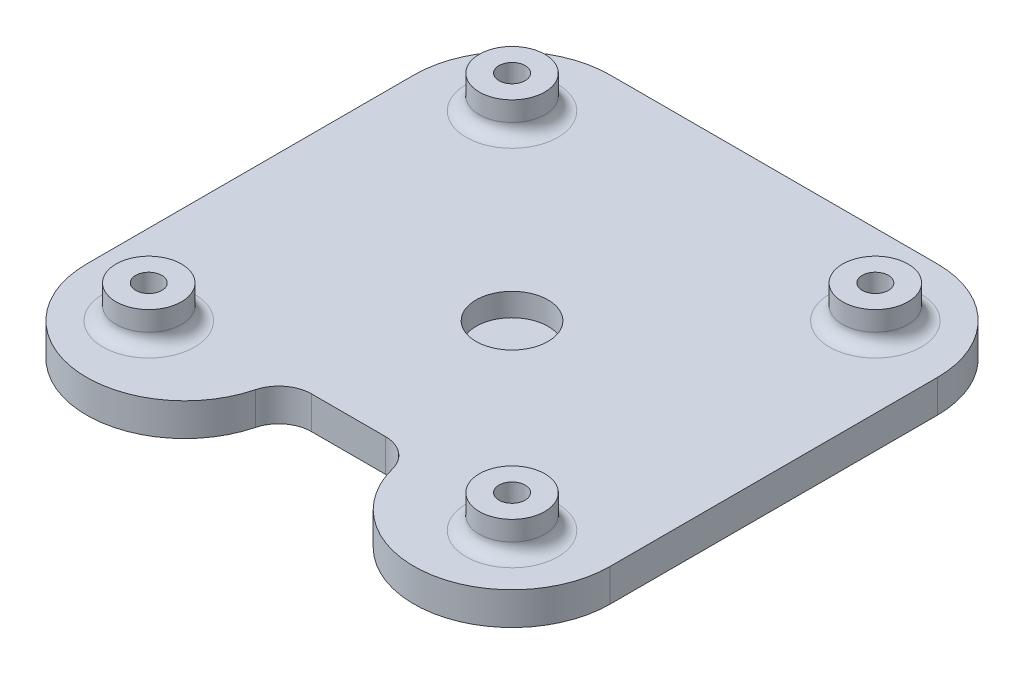
ISO-10303-21;
HEADER;
FILE_DESCRIPTION(('STEP AP214'),'2;1');
FILE_NAME('part.step','',(''),(''),'','','');
FILE_SCHEMA(('AUTOMOTIVE_DESIGN { 1 0 10303 214 1 1 1 1 }'));
ENDSEC;
DATA;
#1=APPLICATION_CONTEXT('core data for automotive mechanical design processes');
#2=APPLICATION_PROTOCOL_DEFINITION('international standard','automotive_design',2000,#1);
#3=PRODUCT_CONTEXT('',#1,'mechanical');
#4=PRODUCT('Part','Part','',(#3));
#5=PRODUCT_RELATED_PRODUCT_CATEGORY('part','',(#4));
#6=PRODUCT_DEFINITION_FORMATION('','',#4);
#7=PRODUCT_DEFINITION_CONTEXT('part definition',#1,'design');
#8=PRODUCT_DEFINITION('design','',#6,#7);
#9=PRODUCT_DEFINITION_SHAPE('','',#8);
#10=(LENGTH_UNIT() NAMED_UNIT(*) SI_UNIT(.MILLI.,.METRE.));
#11=(NAMED_UNIT(*) PLANE_ANGLE_UNIT() SI_UNIT($,.RADIAN.));
#12=(NAMED_UNIT(*) SI_UNIT($,.STERADIAN.) SOLID_ANGLE_UNIT());
#13=UNCERTAINTY_MEASURE_WITH_UNIT(LENGTH_MEASURE(1.E-05),#10,'distance_accuracy_value','');
#14=(GEOMETRIC_REPRESENTATION_CONTEXT(3) GLOBAL_UNCERTAINTY_ASSIGNED_CONTEXT((#13)) GLOBAL_UNIT_ASSIGNED_CONTEXT((#10,
#11,#12)) REPRESENTATION_CONTEXT('',''));
#15=CARTESIAN_POINT('',(0.,0.,0.));
#16=DIRECTION('',(0.,0.,1.));
#17=DIRECTION('',(1.,0.,0.));
#18=AXIS2_PLACEMENT_3D('',#15,#16,#17);
#19=CARTESIAN_POINT('',(50.,10.,50.));
#20=DIRECTION('',(0.,-1.,0.));
#21=DIRECTION('',(0.,0.,-1.));
#22=AXIS2_PLACEMENT_3D('',#19,#20,#21);
#23=CYLINDRICAL_SURFACE('',#22,30.);
#24=CARTESIAN_POINT('',(50.,10.,50.));
#25=DIRECTION('',(0.,1.,0.));
#26=DIRECTION('',(0.,0.,-1.));
#27=AXIS2_PLACEMENT_3D('',#24,#25,#26);
#28=CIRCLE('',#27,30.);
#29=CARTESIAN_POINT('',(20.9526249034444,10.,57.5));
#30=VERTEX_POINT('',#29);
#31=CARTESIAN_POINT('',(80.,10.,50.));
#32=VERTEX_POINT('',#31);
#33=EDGE_CURVE('E117',#30,#32,#28,.T.);
#34=ORIENTED_EDGE('',*,*,#33,.F.);
#35=DIRECTION('',(0.,-1.,0.));
#36=VECTOR('',#35,1.);
#37=CARTESIAN_POINT('',(20.9526249034444,10.,57.5));
#38=LINE('',#37,#36);
#39=CARTESIAN_POINT('',(20.9526249034444,0.,57.5));
#40=VERTEX_POINT('',#39);
#41=EDGE_CURVE('E139',#30,#40,#38,.T.);
#42=ORIENTED_EDGE('',*,*,#41,.T.);
#43=CARTESIAN_POINT('',(50.,0.,50.));
#44=DIRECTION('',(0.,1.,0.));
#45=DIRECTION('',(0.,0.,1.));
#46=AXIS2_PLACEMENT_3D('',#43,#44,#45);
#47=CIRCLE('',#46,30.);
#48=CARTESIAN_POINT('',(80.,0.,50.));
#49=VERTEX_POINT('',#48);
#50=EDGE_CURVE('E135',#40,#49,#47,.T.);
#51=ORIENTED_EDGE('',*,*,#50,.T.);
#52=DIRECTION('',(0.,-1.,0.));
#53=VECTOR('',#52,1.);
#54=CARTESIAN_POINT('',(80.,10.,50.));
#55=LINE('',#54,#53);
#56=EDGE_CURVE('E133',#32,#49,#55,.T.);
#57=ORIENTED_EDGE('',*,*,#56,.F.);
#58=EDGE_LOOP('',(#34,#42,#51,#57));
#59=FACE_BOUND('',#58,.T.);
#60=ADVANCED_FACE('F39',(#59),#23,.T.);
#61=CARTESIAN_POINT('',(80.,10.,-50.));
#62=DIRECTION('',(-1.,0.,0.));
#63=DIRECTION('',(0.,0.,1.));
#64=AXIS2_PLACEMENT_3D('',#61,#62,#63);
#65=PLANE('',#64);
#66=DIRECTION('',(0.,0.,-1.));
#67=VECTOR('',#66,1.);
#68=CARTESIAN_POINT('',(80.,0.,-50.));
#69=LINE('',#68,#67);
#70=CARTESIAN_POINT('',(80.,0.,-50.));
#71=VERTEX_POINT('',#70);
#72=EDGE_CURVE('E170',#49,#71,#69,.T.);
#73=ORIENTED_EDGE('',*,*,#72,.T.);
#74=DIRECTION('',(0.,-1.,0.));
#75=VECTOR('',#74,1.);
#76=CARTESIAN_POINT('',(80.,10.,-50.));
#77=LINE('',#76,#75);
#78=CARTESIAN_POINT('',(80.,10.,-50.));
#79=VERTEX_POINT('',#78);
#80=EDGE_CURVE('E140',#79,#71,#77,.T.);
#81=ORIENTED_EDGE('',*,*,#80,.F.);
#82=DIRECTION('',(0.,0.,-1.));
#83=VECTOR('',#82,1.);
#84=CARTESIAN_POINT('',(80.,10.,-50.));
#85=LINE('',#84,#83);
#86=EDGE_CURVE('E122',#32,#79,#85,.T.);
#87=ORIENTED_EDGE('',*,*,#86,.F.);
#88=ORIENTED_EDGE('',*,*,#56,.T.);
#89=EDGE_LOOP('',(#73,#81,#87,#88));
#90=FACE_BOUND('',#89,.T.);
#91=ADVANCED_FACE('F142',(#90),#65,.F.);
#92=CARTESIAN_POINT('',(50.,10.,-50.));
#93=DIRECTION('',(0.,-1.,0.));
#94=DIRECTION('',(0.,0.,-1.));
#95=AXIS2_PLACEMENT_3D('',#92,#93,#94);
#96=CYLINDRICAL_SURFACE('',#95,30.);
#97=CARTESIAN_POINT('',(50.,0.,-50.));
#98=DIRECTION('',(0.,1.,0.));
#99=DIRECTION('',(0.,0.,-1.));
#100=AXIS2_PLACEMENT_3D('',#97,#98,#99);
#101=CIRCLE('',#100,30.);
#102=CARTESIAN_POINT('',(50.,0.,-80.));
#103=VERTEX_POINT('',#102);
#104=EDGE_CURVE('E174',#71,#103,#101,.T.);
#105=ORIENTED_EDGE('',*,*,#104,.T.);
#106=DIRECTION('',(0.,-1.,0.));
#107=VECTOR('',#106,1.);
#108=CARTESIAN_POINT('',(50.,10.,-80.));
#109=LINE('',#108,#107);
#110=CARTESIAN_POINT('',(50.,10.,-80.));
#111=VERTEX_POINT('',#110);
#112=EDGE_CURVE('E204',#111,#103,#109,.T.);
#113=ORIENTED_EDGE('',*,*,#112,.F.);
#114=CARTESIAN_POINT('',(50.,10.,-50.));
#115=DIRECTION('',(0.,1.,0.));
#116=DIRECTION('',(0.,0.,-1.));
#117=AXIS2_PLACEMENT_3D('',#114,#115,#116);
#118=CIRCLE('',#117,30.);
#119=EDGE_CURVE('E146',#79,#111,#118,.T.);
#120=ORIENTED_EDGE('',*,*,#119,.F.);
#121=ORIENTED_EDGE('',*,*,#80,.T.);
#122=EDGE_LOOP('',(#105,#113,#120,#121));
#123=FACE_BOUND('',#122,.T.);
#124=ADVANCED_FACE('F280',(#123),#96,.T.);
#125=CARTESIAN_POINT('',(-49.9999999999998,10.,-80.));
#126=DIRECTION('',(0.,0.,1.));
#127=DIRECTION('',(1.,0.,0.));
#128=AXIS2_PLACEMENT_3D('',#125,#126,#127);
#129=PLANE('',#128);
#130=DIRECTION('',(-1.,0.,0.));
#131=VECTOR('',#130,1.);
#132=CARTESIAN_POINT('',(-49.9999999999998,0.,-80.));
#133=LINE('',#132,#131);
#134=CARTESIAN_POINT('',(-49.9999999999998,0.,-80.));
#135=VERTEX_POINT('',#134);
#136=EDGE_CURVE('E177',#103,#135,#133,.T.);
#137=ORIENTED_EDGE('',*,*,#136,.T.);
#138=DIRECTION('',(0.,-1.,0.));
#139=VECTOR('',#138,1.);
#140=CARTESIAN_POINT('',(-49.9999999999998,10.,-80.));
#141=LINE('',#140,#139);
#142=CARTESIAN_POINT('',(-49.9999999999998,10.,-80.));
#143=VERTEX_POINT('',#142);
#144=EDGE_CURVE('E200',#143,#135,#141,.T.);
#145=ORIENTED_EDGE('',*,*,#144,.F.);
#146=DIRECTION('',(-1.,0.,0.));
#147=VECTOR('',#146,1.);
#148=CARTESIAN_POINT('',(-49.9999999999998,10.,-80.));
#149=LINE('',#148,#147);
#150=EDGE_CURVE('E149',#111,#143,#149,.T.);
#151=ORIENTED_EDGE('',*,*,#150,.F.);
#152=ORIENTED_EDGE('',*,*,#112,.T.);
#153=EDGE_LOOP('',(#137,#145,#151,#152));
#154=FACE_BOUND('',#153,.T.);
#155=ADVANCED_FACE('F418',(#154),#129,.F.);
#156=CARTESIAN_POINT('',(-50.,10.,-50.));
#157=DIRECTION('',(0.,-1.,0.));
#158=DIRECTION('',(0.,0.,-1.));
#159=AXIS2_PLACEMENT_3D('',#156,#157,#158);
#160=CYLINDRICAL_SURFACE('',#159,30.);
#161=CARTESIAN_POINT('',(-50.,0.,-50.));
#162=DIRECTION('',(0.,1.,0.));
#163=DIRECTION('',(0.,0.,1.));
#164=AXIS2_PLACEMENT_3D('',#161,#162,#163);
#165=CIRCLE('',#164,30.);
#166=CARTESIAN_POINT('',(-80.,0.,-49.9999999999998));
#167=VERTEX_POINT('',#166);
#168=EDGE_CURVE('E180',#135,#167,#165,.T.);
#169=ORIENTED_EDGE('',*,*,#168,.T.);
#170=DIRECTION('',(0.,-1.,0.));
#171=VECTOR('',#170,1.);
#172=CARTESIAN_POINT('',(-80.,10.,-49.9999999999998));
#173=LINE('',#172,#171);
#174=CARTESIAN_POINT('',(-80.,10.,-49.9999999999998));
#175=VERTEX_POINT('',#174);
#176=EDGE_CURVE('E196',#175,#167,#173,.T.);
#177=ORIENTED_EDGE('',*,*,#176,.F.);
#178=CARTESIAN_POINT('',(-50.,10.,-50.));
#179=DIRECTION('',(0.,1.,0.));
#180=DIRECTION('',(0.,0.,1.));
#181=AXIS2_PLACEMENT_3D('',#178,#179,#180);
#182=CIRCLE('',#181,30.);
#183=EDGE_CURVE('E155',#143,#175,#182,.T.);
#184=ORIENTED_EDGE('',*,*,#183,.F.);
#185=ORIENTED_EDGE('',*,*,#144,.T.);
#186=EDGE_LOOP('',(#169,#177,#184,#185));
#187=FACE_BOUND('',#186,.T.);
#188=ADVANCED_FACE('F414',(#187),#160,.T.);
#189=CARTESIAN_POINT('',(-80.,10.,-49.9999999999998));
#190=DIRECTION('',(1.,0.,0.));
#191=DIRECTION('',(0.,0.,-1.));
#192=AXIS2_PLACEMENT_3D('',#189,#190,#191);
#193=PLANE('',#192);
#194=DIRECTION('',(0.,0.,1.));
#195=VECTOR('',#194,1.);
#196=CARTESIAN_POINT('',(-80.,0.,-49.9999999999998));
#197=LINE('',#196,#195);
#198=CARTESIAN_POINT('',(-80.,0.,50.));
#199=VERTEX_POINT('',#198);
#200=EDGE_CURVE('E183',#167,#199,#197,.T.);
#201=ORIENTED_EDGE('',*,*,#200,.T.);
#202=DIRECTION('',(0.,-1.,0.));
#203=VECTOR('',#202,1.);
#204=CARTESIAN_POINT('',(-80.,10.,50.));
#205=LINE('',#204,#203);
#206=CARTESIAN_POINT('',(-80.,10.,50.));
#207=VERTEX_POINT('',#206);
#208=EDGE_CURVE('E167',#207,#199,#205,.T.);
#209=ORIENTED_EDGE('',*,*,#208,.F.);
#210=DIRECTION('',(0.,0.,1.));
#211=VECTOR('',#210,1.);
#212=CARTESIAN_POINT('',(-80.,10.,-49.9999999999998));
#213=LINE('',#212,#211);
#214=EDGE_CURVE('E158',#175,#207,#213,.T.);
#215=ORIENTED_EDGE('',*,*,#214,.F.);
#216=ORIENTED_EDGE('',*,*,#176,.T.);
#217=EDGE_LOOP('',(#201,#209,#215,#216));
#218=FACE_BOUND('',#217,.T.);
#219=ADVANCED_FACE('F411',(#218),#193,.F.);
#220=CARTESIAN_POINT('',(-50.,10.,50.));
#221=DIRECTION('',(0.,-1.,0.));
#222=DIRECTION('',(0.,0.,-1.));
#223=AXIS2_PLACEMENT_3D('',#220,#221,#222);
#224=CYLINDRICAL_SURFACE('',#223,30.);
#225=CARTESIAN_POINT('',(-50.,0.,50.));
#226=DIRECTION('',(0.,1.,0.));
#227=DIRECTION('',(0.,0.,1.));
#228=AXIS2_PLACEMENT_3D('',#225,#226,#227);
#229=CIRCLE('',#228,30.);
#230=CARTESIAN_POINT('',(-20.9526249034444,0.,57.5));
#231=VERTEX_POINT('',#230);
#232=EDGE_CURVE('E187',#199,#231,#229,.T.);
#233=ORIENTED_EDGE('',*,*,#232,.T.);
#234=DIRECTION('',(0.,-1.,0.));
#235=VECTOR('',#234,1.);
#236=CARTESIAN_POINT('',(-20.9526249034444,10.,57.5));
#237=LINE('',#236,#235);
#238=CARTESIAN_POINT('',(-20.9526249034444,10.,57.5));
#239=VERTEX_POINT('',#238);
#240=EDGE_CURVE('E55',#231,#239,#237,.F.);
#241=ORIENTED_EDGE('',*,*,#240,.T.);
#242=CARTESIAN_POINT('',(-50.,10.,50.));
#243=DIRECTION('',(0.,1.,0.));
#244=DIRECTION('',(0.,0.,1.));
#245=AXIS2_PLACEMENT_3D('',#242,#243,#244);
#246=CIRCLE('',#245,30.);
#247=EDGE_CURVE('E161',#207,#239,#246,.T.);
#248=ORIENTED_EDGE('',*,*,#247,.F.);
#249=ORIENTED_EDGE('',*,*,#208,.T.);
#250=EDGE_LOOP('',(#233,#241,#248,#249));
#251=FACE_BOUND('',#250,.T.);
#252=ADVANCED_FACE('F407',(#251),#224,.T.);
#253=CARTESIAN_POINT('',(-20.,10.,50.));
#254=DIRECTION('',(0.,0.,-1.));
#255=DIRECTION('',(-1.,0.,0.));
#256=AXIS2_PLACEMENT_3D('',#253,#254,#255);
#257=PLANE('',#256);
#258=DIRECTION('',(1.,0.,0.));
#259=VECTOR('',#258,1.);
#260=CARTESIAN_POINT('',(-20.,0.,50.));
#261=LINE('',#260,#259);
#262=CARTESIAN_POINT('',(-11.2701665379259,0.,50.));
#263=VERTEX_POINT('',#262);
#264=CARTESIAN_POINT('',(11.2701665379258,0.,50.));
#265=VERTEX_POINT('',#264);
#266=EDGE_CURVE('E130',#263,#265,#261,.T.);
#267=ORIENTED_EDGE('',*,*,#266,.T.);
#268=DIRECTION('',(0.,1.,0.));
#269=VECTOR('',#268,1.);
#270=CARTESIAN_POINT('',(11.2701665379258,10.,50.));
#271=LINE('',#270,#269);
#272=CARTESIAN_POINT('',(11.2701665379258,10.,50.));
#273=VERTEX_POINT('',#272);
#274=EDGE_CURVE('E216',#265,#273,#271,.T.);
#275=ORIENTED_EDGE('',*,*,#274,.T.);
#276=DIRECTION('',(1.,0.,0.));
#277=VECTOR('',#276,1.);
#278=CARTESIAN_POINT('',(-20.,10.,50.));
#279=LINE('',#278,#277);
#280=CARTESIAN_POINT('',(-11.2701665379259,10.,50.));
#281=VERTEX_POINT('',#280);
#282=EDGE_CURVE('E164',#281,#273,#279,.T.);
#283=ORIENTED_EDGE('',*,*,#282,.F.);
#284=DIRECTION('',(0.,1.,0.));
#285=VECTOR('',#284,1.);
#286=CARTESIAN_POINT('',(-11.2701665379258,0.,50.));
#287=LINE('',#286,#285);
#288=EDGE_CURVE('E212',#281,#263,#287,.F.);
#289=ORIENTED_EDGE('',*,*,#288,.T.);
#290=EDGE_LOOP('',(#267,#275,#283,#289));
#291=FACE_BOUND('',#290,.T.);
#292=ADVANCED_FACE('F400',(#291),#257,.F.);
#293=CARTESIAN_POINT('',(50.,10.,50.));
#294=DIRECTION('',(0.,-1.,0.));
#295=DIRECTION('',(0.,0.,-1.));
#296=AXIS2_PLACEMENT_3D('',#293,#294,#295);
#297=PLANE('',#296);
#298=CARTESIAN_POINT('',(0.,10.,0.));
#299=DIRECTION('',(0.,1.,0.));
#300=DIRECTION('',(0.,0.,1.));
#301=AXIS2_PLACEMENT_3D('',#298,#299,#300);
#302=CIRCLE('',#301,11.);
#303=CARTESIAN_POINT('',(0.,10.,11.));
#304=VERTEX_POINT('',#303);
#305=EDGE_CURVE('E580',#304,#304,#302,.T.);
#306=ORIENTED_EDGE('',*,*,#305,.F.);
#307=EDGE_LOOP('',(#306));
#308=FACE_BOUND('',#307,.T.);
#309=CARTESIAN_POINT('',(-55.5,10.,-55.5));
#310=DIRECTION('',(0.,-1.,0.));
#311=DIRECTION('',(0.,0.,-1.));
#312=AXIS2_PLACEMENT_3D('',#309,#310,#311);
#313=CIRCLE('',#312,14.);
#314=CARTESIAN_POINT('',(-55.5,10.,-69.5));
#315=VERTEX_POINT('',#314);
#316=EDGE_CURVE('E247',#315,#315,#313,.T.);
#317=ORIENTED_EDGE('',*,*,#316,.T.);
#318=EDGE_LOOP('',(#317));
#319=FACE_BOUND('',#318,.T.);
#320=CARTESIAN_POINT('',(55.5,10.,-55.5));
#321=DIRECTION('',(0.,-1.,0.));
#322=DIRECTION('',(0.,0.,-1.));
#323=AXIS2_PLACEMENT_3D('',#320,#321,#322);
#324=CIRCLE('',#323,14.);
#325=CARTESIAN_POINT('',(55.5,10.,-69.5));
#326=VERTEX_POINT('',#325);
#327=EDGE_CURVE('E243',#326,#326,#324,.T.);
#328=ORIENTED_EDGE('',*,*,#327,.T.);
#329=EDGE_LOOP('',(#328));
#330=FACE_BOUND('',#329,.T.);
#331=CARTESIAN_POINT('',(55.5,10.,55.5));
#332=DIRECTION('',(0.,-1.,0.));
#333=DIRECTION('',(0.,0.,-1.));
#334=AXIS2_PLACEMENT_3D('',#331,#332,#333);
#335=CIRCLE('',#334,14.);
#336=CARTESIAN_POINT('',(55.5,10.,41.5));
#337=VERTEX_POINT('',#336);
#338=EDGE_CURVE('E239',#337,#337,#335,.T.);
#339=ORIENTED_EDGE('',*,*,#338,.T.);
#340=EDGE_LOOP('',(#339));
#341=FACE_BOUND('',#340,.T.);
#342=CARTESIAN_POINT('',(-55.5,10.,55.5));
#343=DIRECTION('',(0.,-1.,0.));
#344=DIRECTION('',(0.,0.,-1.));
#345=AXIS2_PLACEMENT_3D('',#342,#343,#344);
#346=CIRCLE('',#345,14.);
#347=CARTESIAN_POINT('',(-55.5,10.,41.5));
#348=VERTEX_POINT('',#347);
#349=EDGE_CURVE('E235',#348,#348,#346,.T.);
#350=ORIENTED_EDGE('',*,*,#349,.T.);
#351=EDGE_LOOP('',(#350));
#352=FACE_BOUND('',#351,.T.);
#353=ORIENTED_EDGE('',*,*,#282,.T.);
#354=CARTESIAN_POINT('',(11.2701665379258,10.,60.));
#355=DIRECTION('',(0.,-1.,0.));
#356=DIRECTION('',(0.,0.,-1.));
#357=AXIS2_PLACEMENT_3D('',#354,#355,#356);
#358=CIRCLE('',#357,10.);
#359=EDGE_CURVE('E125',#273,#30,#358,.T.);
#360=ORIENTED_EDGE('',*,*,#359,.T.);
#361=ORIENTED_EDGE('',*,*,#33,.T.);
#362=ORIENTED_EDGE('',*,*,#86,.T.);
#363=ORIENTED_EDGE('',*,*,#119,.T.);
#364=ORIENTED_EDGE('',*,*,#150,.T.);
#365=ORIENTED_EDGE('',*,*,#183,.T.);
#366=ORIENTED_EDGE('',*,*,#214,.T.);
#367=ORIENTED_EDGE('',*,*,#247,.T.);
#368=CARTESIAN_POINT('',(-11.2701665379258,10.,60.));
#369=DIRECTION('',(0.,-1.,0.));
#370=DIRECTION('',(0.,0.,-1.));
#371=AXIS2_PLACEMENT_3D('',#368,#369,#370);
#372=CIRCLE('',#371,10.);
#373=EDGE_CURVE('E228',#239,#281,#372,.T.);
#374=ORIENTED_EDGE('',*,*,#373,.T.);
#375=EDGE_LOOP('',(#353,#360,#361,#362,#363,#364,#365,#366,#367,#374));
#376=FACE_BOUND('',#375,.T.);
#377=ADVANCED_FACE('F120',(#308,#319,#330,#341,#352,#376),#297,.F.);
#378=CARTESIAN_POINT('',(50.,0.,50.));
#379=DIRECTION('',(0.,-1.,0.));
#380=DIRECTION('',(0.,0.,-1.));
#381=AXIS2_PLACEMENT_3D('',#378,#379,#380);
#382=PLANE('',#381);
#383=CARTESIAN_POINT('',(55.5,0.,-55.5));
#384=DIRECTION('',(0.,1.,0.));
#385=DIRECTION('',(0.,0.,1.));
#386=AXIS2_PLACEMENT_3D('',#383,#384,#385);
#387=CIRCLE('',#386,4.);
#388=CARTESIAN_POINT('',(55.5,0.,-51.5));
#389=VERTEX_POINT('',#388);
#390=EDGE_CURVE('E331',#389,#389,#387,.T.);
#391=ORIENTED_EDGE('',*,*,#390,.T.);
#392=EDGE_LOOP('',(#391));
#393=FACE_BOUND('',#392,.T.);
#394=CARTESIAN_POINT('',(-55.5,0.,55.5));
#395=DIRECTION('',(0.,1.,0.));
#396=DIRECTION('',(0.,0.,1.));
#397=AXIS2_PLACEMENT_3D('',#394,#395,#396);
#398=CIRCLE('',#397,4.);
#399=CARTESIAN_POINT('',(-55.5,0.,59.5));
#400=VERTEX_POINT('',#399);
#401=EDGE_CURVE('E324',#400,#400,#398,.T.);
#402=ORIENTED_EDGE('',*,*,#401,.T.);
#403=EDGE_LOOP('',(#402));
#404=FACE_BOUND('',#403,.T.);
#405=CARTESIAN_POINT('',(55.5,0.,55.5));
#406=DIRECTION('',(0.,1.,0.));
#407=DIRECTION('',(0.,0.,1.));
#408=AXIS2_PLACEMENT_3D('',#405,#406,#407);
#409=CIRCLE('',#408,4.);
#410=CARTESIAN_POINT('',(55.5,0.,59.5));
#411=VERTEX_POINT('',#410);
#412=EDGE_CURVE('E318',#411,#411,#409,.T.);
#413=ORIENTED_EDGE('',*,*,#412,.T.);
#414=EDGE_LOOP('',(#413));
#415=FACE_BOUND('',#414,.T.);
#416=CARTESIAN_POINT('',(-55.5,0.,-55.5));
#417=DIRECTION('',(0.,1.,0.));
#418=DIRECTION('',(0.,0.,1.));
#419=AXIS2_PLACEMENT_3D('',#416,#417,#418);
#420=CIRCLE('',#419,4.);
#421=CARTESIAN_POINT('',(-55.5,0.,-51.5));
#422=VERTEX_POINT('',#421);
#423=EDGE_CURVE('E171',#422,#422,#420,.T.);
#424=ORIENTED_EDGE('',*,*,#423,.T.);
#425=EDGE_LOOP('',(#424));
#426=FACE_BOUND('',#425,.T.);
#427=ORIENTED_EDGE('',*,*,#50,.F.);
#428=CARTESIAN_POINT('',(11.2701665379258,0.,60.));
#429=DIRECTION('',(0.,-1.,0.));
#430=DIRECTION('',(0.,0.,-1.));
#431=AXIS2_PLACEMENT_3D('',#428,#429,#430);
#432=CIRCLE('',#431,10.);
#433=EDGE_CURVE('E221',#40,#265,#432,.F.);
#434=ORIENTED_EDGE('',*,*,#433,.T.);
#435=ORIENTED_EDGE('',*,*,#266,.F.);
#436=CARTESIAN_POINT('',(-11.2701665379258,0.,60.));
#437=DIRECTION('',(0.,-1.,0.));
#438=DIRECTION('',(0.,0.,-1.));
#439=AXIS2_PLACEMENT_3D('',#436,#437,#438);
#440=CIRCLE('',#439,10.);
#441=EDGE_CURVE('E63',#263,#231,#440,.F.);
#442=ORIENTED_EDGE('',*,*,#441,.T.);
#443=ORIENTED_EDGE('',*,*,#232,.F.);
#444=ORIENTED_EDGE('',*,*,#200,.F.);
#445=ORIENTED_EDGE('',*,*,#168,.F.);
#446=ORIENTED_EDGE('',*,*,#136,.F.);
#447=ORIENTED_EDGE('',*,*,#104,.F.);
#448=ORIENTED_EDGE('',*,*,#72,.F.);
#449=EDGE_LOOP('',(#427,#434,#435,#442,#443,#444,#445,#446,#447,#448));
#450=FACE_BOUND('',#449,.T.);
#451=ADVANCED_FACE('F288',(#393,#404,#415,#426,#450),#382,.T.);
#452=CARTESIAN_POINT('',(11.2701665379258,10.,60.));
#453=DIRECTION('',(0.,-1.,0.));
#454=DIRECTION('',(0.,0.,-1.));
#455=AXIS2_PLACEMENT_3D('',#452,#453,#454);
#456=CYLINDRICAL_SURFACE('',#455,10.);
#457=ORIENTED_EDGE('',*,*,#359,.F.);
#458=ORIENTED_EDGE('',*,*,#274,.F.);
#459=ORIENTED_EDGE('',*,*,#433,.F.);
#460=ORIENTED_EDGE('',*,*,#41,.F.);
#461=EDGE_LOOP('',(#457,#458,#459,#460));
#462=FACE_BOUND('',#461,.T.);
#463=ADVANCED_FACE('F284',(#462),#456,.F.);
#464=CARTESIAN_POINT('',(-11.2701665379258,10.,60.));
#465=DIRECTION('',(0.,-1.,0.));
#466=DIRECTION('',(0.,0.,-1.));
#467=AXIS2_PLACEMENT_3D('',#464,#465,#466);
#468=CYLINDRICAL_SURFACE('',#467,10.);
#469=ORIENTED_EDGE('',*,*,#373,.F.);
#470=ORIENTED_EDGE('',*,*,#240,.F.);
#471=ORIENTED_EDGE('',*,*,#441,.F.);
#472=ORIENTED_EDGE('',*,*,#288,.F.);
#473=EDGE_LOOP('',(#469,#470,#471,#472));
#474=FACE_BOUND('',#473,.T.);
#475=ADVANCED_FACE('F287',(#474),#468,.F.);
#476=CARTESIAN_POINT('',(-55.5,0.,-55.5));
#477=DIRECTION('',(0.,1.,0.));
#478=DIRECTION('',(0.,0.,1.));
#479=AXIS2_PLACEMENT_3D('',#476,#477,#478);
#480=CYLINDRICAL_SURFACE('',#479,4.);
#481=ORIENTED_EDGE('',*,*,#423,.F.);
#482=EDGE_LOOP('',(#481));
#483=FACE_BOUND('',#482,.T.);
#484=CARTESIAN_POINT('',(-55.5,20.,-55.5));
#485=DIRECTION('',(0.,-1.,0.));
#486=DIRECTION('',(0.,0.,-1.));
#487=AXIS2_PLACEMENT_3D('',#484,#485,#486);
#488=CIRCLE('',#487,4.);
#489=CARTESIAN_POINT('',(-55.5,20.,-59.5));
#490=VERTEX_POINT('',#489);
#491=EDGE_CURVE('E348',#490,#490,#488,.T.);
#492=ORIENTED_EDGE('',*,*,#491,.F.);
#493=EDGE_LOOP('',(#492));
#494=FACE_BOUND('',#493,.T.);
#495=ADVANCED_FACE('F292',(#483,#494),#480,.F.);
#496=CARTESIAN_POINT('',(55.5,0.,55.5));
#497=DIRECTION('',(0.,1.,0.));
#498=DIRECTION('',(0.,0.,1.));
#499=AXIS2_PLACEMENT_3D('',#496,#497,#498);
#500=CYLINDRICAL_SURFACE('',#499,4.);
#501=ORIENTED_EDGE('',*,*,#412,.F.);
#502=EDGE_LOOP('',(#501));
#503=FACE_BOUND('',#502,.T.);
#504=CARTESIAN_POINT('',(55.5,20.,55.5));
#505=DIRECTION('',(0.,-1.,0.));
#506=DIRECTION('',(0.,0.,-1.));
#507=AXIS2_PLACEMENT_3D('',#504,#505,#506);
#508=CIRCLE('',#507,4.);
#509=CARTESIAN_POINT('',(55.5,20.,51.5));
#510=VERTEX_POINT('',#509);
#511=EDGE_CURVE('E359',#510,#510,#508,.T.);
#512=ORIENTED_EDGE('',*,*,#511,.F.);
#513=EDGE_LOOP('',(#512));
#514=FACE_BOUND('',#513,.T.);
#515=ADVANCED_FACE('F344',(#503,#514),#500,.F.);
#516=CARTESIAN_POINT('',(-55.5,0.,55.5));
#517=DIRECTION('',(0.,1.,0.));
#518=DIRECTION('',(0.,0.,1.));
#519=AXIS2_PLACEMENT_3D('',#516,#517,#518);
#520=CYLINDRICAL_SURFACE('',#519,4.);
#521=ORIENTED_EDGE('',*,*,#401,.F.);
#522=EDGE_LOOP('',(#521));
#523=FACE_BOUND('',#522,.T.);
#524=CARTESIAN_POINT('',(-55.5,20.,55.5));
#525=DIRECTION('',(0.,-1.,0.));
#526=DIRECTION('',(0.,0.,-1.));
#527=AXIS2_PLACEMENT_3D('',#524,#525,#526);
#528=CIRCLE('',#527,4.);
#529=CARTESIAN_POINT('',(-55.5,20.,51.5));
#530=VERTEX_POINT('',#529);
#531=EDGE_CURVE('E352',#530,#530,#528,.T.);
#532=ORIENTED_EDGE('',*,*,#531,.F.);
#533=EDGE_LOOP('',(#532));
#534=FACE_BOUND('',#533,.T.);
#535=ADVANCED_FACE('F390',(#523,#534),#520,.F.);
#536=CARTESIAN_POINT('',(55.5,0.,-55.5));
#537=DIRECTION('',(0.,1.,0.));
#538=DIRECTION('',(0.,0.,1.));
#539=AXIS2_PLACEMENT_3D('',#536,#537,#538);
#540=CYLINDRICAL_SURFACE('',#539,4.);
#541=ORIENTED_EDGE('',*,*,#390,.F.);
#542=EDGE_LOOP('',(#541));
#543=FACE_BOUND('',#542,.T.);
#544=CARTESIAN_POINT('',(55.5,20.,-55.5));
#545=DIRECTION('',(0.,-1.,0.));
#546=DIRECTION('',(0.,0.,-1.));
#547=AXIS2_PLACEMENT_3D('',#544,#545,#546);
#548=CIRCLE('',#547,4.);
#549=CARTESIAN_POINT('',(55.5,20.,-59.5));
#550=VERTEX_POINT('',#549);
#551=EDGE_CURVE('E362',#550,#550,#548,.T.);
#552=ORIENTED_EDGE('',*,*,#551,.F.);
#553=EDGE_LOOP('',(#552));
#554=FACE_BOUND('',#553,.T.);
#555=ADVANCED_FACE('F311',(#543,#554),#540,.F.);
#556=CARTESIAN_POINT('',(-55.5,20.,-55.5));
#557=DIRECTION('',(0.,-1.,0.));
#558=DIRECTION('',(0.,0.,-1.));
#559=AXIS2_PLACEMENT_3D('',#556,#557,#558);
#560=CYLINDRICAL_SURFACE('',#559,10.);
#561=CARTESIAN_POINT('',(-55.5,14.,-55.5));
#562=DIRECTION('',(0.,-1.,0.));
#563=DIRECTION('',(0.,0.,-1.));
#564=AXIS2_PLACEMENT_3D('',#561,#562,#563);
#565=CIRCLE('',#564,10.);
#566=CARTESIAN_POINT('',(-55.5,14.,-65.5));
#567=VERTEX_POINT('',#566);
#568=EDGE_CURVE('E231',#567,#567,#565,.F.);
#569=ORIENTED_EDGE('',*,*,#568,.T.);
#570=EDGE_LOOP('',(#569));
#571=FACE_BOUND('',#570,.T.);
#572=CARTESIAN_POINT('',(-55.5,20.,-55.5));
#573=DIRECTION('',(0.,1.,0.));
#574=DIRECTION('',(0.,0.,1.));
#575=AXIS2_PLACEMENT_3D('',#572,#573,#574);
#576=CIRCLE('',#575,10.);
#577=CARTESIAN_POINT('',(-55.5,20.,-45.5));
#578=VERTEX_POINT('',#577);
#579=EDGE_CURVE('E315',#578,#578,#576,.T.);
#580=ORIENTED_EDGE('',*,*,#579,.F.);
#581=EDGE_LOOP('',(#580));
#582=FACE_BOUND('',#581,.T.);
#583=ADVANCED_FACE('F307',(#571,#582),#560,.T.);
#584=CARTESIAN_POINT('',(-55.5,20.,-55.5));
#585=DIRECTION('',(0.,1.,0.));
#586=DIRECTION('',(0.,0.,1.));
#587=AXIS2_PLACEMENT_3D('',#584,#585,#586);
#588=PLANE('',#587);
#589=ORIENTED_EDGE('',*,*,#491,.T.);
#590=EDGE_LOOP('',(#589));
#591=FACE_BOUND('',#590,.T.);
#592=ORIENTED_EDGE('',*,*,#579,.T.);
#593=EDGE_LOOP('',(#592));
#594=FACE_BOUND('',#593,.T.);
#595=ADVANCED_FACE('F310',(#591,#594),#588,.T.);
#596=CARTESIAN_POINT('',(-55.5,20.,55.5));
#597=DIRECTION('',(0.,-1.,0.));
#598=DIRECTION('',(0.,0.,-1.));
#599=AXIS2_PLACEMENT_3D('',#596,#597,#598);
#600=CYLINDRICAL_SURFACE('',#599,10.);
#601=CARTESIAN_POINT('',(-55.5,14.,55.5));
#602=DIRECTION('',(0.,-1.,0.));
#603=DIRECTION('',(0.,0.,-1.));
#604=AXIS2_PLACEMENT_3D('',#601,#602,#603);
#605=CIRCLE('',#604,10.);
#606=CARTESIAN_POINT('',(-55.5,14.,45.5));
#607=VERTEX_POINT('',#606);
#608=EDGE_CURVE('E11',#607,#607,#605,.F.);
#609=ORIENTED_EDGE('',*,*,#608,.T.);
#610=EDGE_LOOP('',(#609));
#611=FACE_BOUND('',#610,.T.);
#612=CARTESIAN_POINT('',(-55.5,20.,55.5));
#613=DIRECTION('',(0.,1.,0.));
#614=DIRECTION('',(0.,0.,1.));
#615=AXIS2_PLACEMENT_3D('',#612,#613,#614);
#616=CIRCLE('',#615,10.);
#617=CARTESIAN_POINT('',(-55.5,20.,65.5));
#618=VERTEX_POINT('',#617);
#619=EDGE_CURVE('E319',#618,#618,#616,.T.);
#620=ORIENTED_EDGE('',*,*,#619,.F.);
#621=EDGE_LOOP('',(#620));
#622=FACE_BOUND('',#621,.T.);
#623=ADVANCED_FACE('F378',(#611,#622),#600,.T.);
#624=CARTESIAN_POINT('',(-55.5,20.,55.5));
#625=DIRECTION('',(0.,1.,0.));
#626=DIRECTION('',(0.,0.,1.));
#627=AXIS2_PLACEMENT_3D('',#624,#625,#626);
#628=PLANE('',#627);
#629=ORIENTED_EDGE('',*,*,#531,.T.);
#630=EDGE_LOOP('',(#629));
#631=FACE_BOUND('',#630,.T.);
#632=ORIENTED_EDGE('',*,*,#619,.T.);
#633=EDGE_LOOP('',(#632));
#634=FACE_BOUND('',#633,.T.);
#635=ADVANCED_FACE('F370',(#631,#634),#628,.T.);
#636=CARTESIAN_POINT('',(55.5,20.,55.5));
#637=DIRECTION('',(0.,-1.,0.));
#638=DIRECTION('',(0.,0.,-1.));
#639=AXIS2_PLACEMENT_3D('',#636,#637,#638);
#640=CYLINDRICAL_SURFACE('',#639,10.);
#641=CARTESIAN_POINT('',(55.5,14.,55.5));
#642=DIRECTION('',(0.,-1.,0.));
#643=DIRECTION('',(0.,0.,-1.));
#644=AXIS2_PLACEMENT_3D('',#641,#642,#643);
#645=CIRCLE('',#644,10.);
#646=CARTESIAN_POINT('',(55.5,14.,45.5));
#647=VERTEX_POINT('',#646);
#648=EDGE_CURVE('E48',#647,#647,#645,.F.);
#649=ORIENTED_EDGE('',*,*,#648,.T.);
#650=EDGE_LOOP('',(#649));
#651=FACE_BOUND('',#650,.T.);
#652=CARTESIAN_POINT('',(55.5,20.,55.5));
#653=DIRECTION('',(0.,1.,0.));
#654=DIRECTION('',(0.,0.,1.));
#655=AXIS2_PLACEMENT_3D('',#652,#653,#654);
#656=CIRCLE('',#655,10.);
#657=CARTESIAN_POINT('',(55.5,20.,65.5));
#658=VERTEX_POINT('',#657);
#659=EDGE_CURVE('E327',#658,#658,#656,.T.);
#660=ORIENTED_EDGE('',*,*,#659,.F.);
#661=EDGE_LOOP('',(#660));
#662=FACE_BOUND('',#661,.T.);
#663=ADVANCED_FACE('F258',(#651,#662),#640,.T.);
#664=CARTESIAN_POINT('',(55.5,20.,55.5));
#665=DIRECTION('',(0.,1.,0.));
#666=DIRECTION('',(0.,0.,1.));
#667=AXIS2_PLACEMENT_3D('',#664,#665,#666);
#668=PLANE('',#667);
#669=ORIENTED_EDGE('',*,*,#511,.T.);
#670=EDGE_LOOP('',(#669));
#671=FACE_BOUND('',#670,.T.);
#672=ORIENTED_EDGE('',*,*,#659,.T.);
#673=EDGE_LOOP('',(#672));
#674=FACE_BOUND('',#673,.T.);
#675=ADVANCED_FACE('F368',(#671,#674),#668,.T.);
#676=CARTESIAN_POINT('',(55.5,20.,-55.5));
#677=DIRECTION('',(0.,-1.,0.));
#678=DIRECTION('',(0.,0.,-1.));
#679=AXIS2_PLACEMENT_3D('',#676,#677,#678);
#680=CYLINDRICAL_SURFACE('',#679,10.);
#681=CARTESIAN_POINT('',(55.5,14.,-55.5));
#682=DIRECTION('',(0.,-1.,0.));
#683=DIRECTION('',(0.,0.,-1.));
#684=AXIS2_PLACEMENT_3D('',#681,#682,#683);
#685=CIRCLE('',#684,10.);
#686=CARTESIAN_POINT('',(55.5,14.,-65.5));
#687=VERTEX_POINT('',#686);
#688=EDGE_CURVE('E251',#687,#687,#685,.F.);
#689=ORIENTED_EDGE('',*,*,#688,.T.);
#690=EDGE_LOOP('',(#689));
#691=FACE_BOUND('',#690,.T.);
#692=CARTESIAN_POINT('',(55.5,20.,-55.5));
#693=DIRECTION('',(0.,1.,0.));
#694=DIRECTION('',(0.,0.,1.));
#695=AXIS2_PLACEMENT_3D('',#692,#693,#694);
#696=CIRCLE('',#695,10.);
#697=CARTESIAN_POINT('',(55.5,20.,-45.5));
#698=VERTEX_POINT('',#697);
#699=EDGE_CURVE('E351',#698,#698,#696,.T.);
#700=ORIENTED_EDGE('',*,*,#699,.F.);
#701=EDGE_LOOP('',(#700));
#702=FACE_BOUND('',#701,.T.);
#703=ADVANCED_FACE('F300',(#691,#702),#680,.T.);
#704=CARTESIAN_POINT('',(55.5,20.,-55.5));
#705=DIRECTION('',(0.,1.,0.));
#706=DIRECTION('',(0.,0.,1.));
#707=AXIS2_PLACEMENT_3D('',#704,#705,#706);
#708=PLANE('',#707);
#709=ORIENTED_EDGE('',*,*,#551,.T.);
#710=EDGE_LOOP('',(#709));
#711=FACE_BOUND('',#710,.T.);
#712=ORIENTED_EDGE('',*,*,#699,.T.);
#713=EDGE_LOOP('',(#712));
#714=FACE_BOUND('',#713,.T.);
#715=ADVANCED_FACE('F295',(#711,#714),#708,.T.);
#716=CARTESIAN_POINT('',(-55.5,14.,-55.5));
#717=DIRECTION('',(0.,-1.,0.));
#718=DIRECTION('',(0.,0.,-1.));
#719=AXIS2_PLACEMENT_3D('',#716,#717,#718);
#720=TOROIDAL_SURFACE('',#719,14.,4.);
#721=ORIENTED_EDGE('',*,*,#316,.F.);
#722=EDGE_LOOP('',(#721));
#723=FACE_BOUND('',#722,.T.);
#724=ORIENTED_EDGE('',*,*,#568,.F.);
#725=EDGE_LOOP('',(#724));
#726=FACE_BOUND('',#725,.T.);
#727=ADVANCED_FACE('F271',(#723,#726),#720,.F.);
#728=CARTESIAN_POINT('',(55.5,14.,-55.5));
#729=DIRECTION('',(0.,-1.,0.));
#730=DIRECTION('',(0.,0.,-1.));
#731=AXIS2_PLACEMENT_3D('',#728,#729,#730);
#732=TOROIDAL_SURFACE('',#731,14.,4.);
#733=ORIENTED_EDGE('',*,*,#327,.F.);
#734=EDGE_LOOP('',(#733));
#735=FACE_BOUND('',#734,.T.);
#736=ORIENTED_EDGE('',*,*,#688,.F.);
#737=EDGE_LOOP('',(#736));
#738=FACE_BOUND('',#737,.T.);
#739=ADVANCED_FACE('F263',(#735,#738),#732,.F.);
#740=CARTESIAN_POINT('',(55.5,14.,55.5));
#741=DIRECTION('',(0.,-1.,0.));
#742=DIRECTION('',(0.,0.,-1.));
#743=AXIS2_PLACEMENT_3D('',#740,#741,#742);
#744=TOROIDAL_SURFACE('',#743,14.,4.);
#745=ORIENTED_EDGE('',*,*,#338,.F.);
#746=EDGE_LOOP('',(#745));
#747=FACE_BOUND('',#746,.T.);
#748=ORIENTED_EDGE('',*,*,#648,.F.);
#749=EDGE_LOOP('',(#748));
#750=FACE_BOUND('',#749,.T.);
#751=ADVANCED_FACE('F261',(#747,#750),#744,.F.);
#752=CARTESIAN_POINT('',(-55.5,14.,55.5));
#753=DIRECTION('',(0.,-1.,0.));
#754=DIRECTION('',(0.,0.,-1.));
#755=AXIS2_PLACEMENT_3D('',#752,#753,#754);
#756=TOROIDAL_SURFACE('',#755,14.,4.);
#757=ORIENTED_EDGE('',*,*,#349,.F.);
#758=EDGE_LOOP('',(#757));
#759=FACE_BOUND('',#758,.T.);
#760=ORIENTED_EDGE('',*,*,#608,.F.);
#761=EDGE_LOOP('',(#760));
#762=FACE_BOUND('',#761,.T.);
#763=ADVANCED_FACE('F41',(#759,#762),#756,.F.);
#764=CARTESIAN_POINT('',(0.,3.,0.));
#765=DIRECTION('',(0.,1.,0.));
#766=DIRECTION('',(0.,0.,1.));
#767=AXIS2_PLACEMENT_3D('',#764,#765,#766);
#768=CYLINDRICAL_SURFACE('',#767,11.);
#769=CARTESIAN_POINT('',(0.,3.,0.));
#770=DIRECTION('',(0.,1.,0.));
#771=DIRECTION('',(0.,0.,1.));
#772=AXIS2_PLACEMENT_3D('',#769,#770,#771);
#773=CIRCLE('',#772,11.);
#774=CARTESIAN_POINT('',(0.,3.,11.));
#775=VERTEX_POINT('',#774);
#776=EDGE_CURVE('E578',#775,#775,#773,.T.);
#777=ORIENTED_EDGE('',*,*,#776,.F.);
#778=EDGE_LOOP('',(#777));
#779=FACE_BOUND('',#778,.T.);
#780=ORIENTED_EDGE('',*,*,#305,.T.);
#781=EDGE_LOOP('',(#780));
#782=FACE_BOUND('',#781,.T.);
#783=ADVANCED_FACE('F269',(#779,#782),#768,.F.);
#784=CARTESIAN_POINT('',(0.,3.,0.));
#785=DIRECTION('',(0.,1.,0.));
#786=DIRECTION('',(0.,0.,1.));
#787=AXIS2_PLACEMENT_3D('',#784,#785,#786);
#788=PLANE('',#787);
#789=ORIENTED_EDGE('',*,*,#776,.T.);
#790=EDGE_LOOP('',(#789));
#791=FACE_BOUND('',#790,.T.);
#792=ADVANCED_FACE('F562',(#791),#788,.T.);
#793=CLOSED_SHELL('',(#60,#91,#124,#155,#188,#219,#252,#292,#377,#451,#463,#475,#495,#515,#535,
#555,#583,#595,#623,#635,#663,#675,#703,#715,#727,#739,#751,#763,#783,#792));
#794=MANIFOLD_SOLID_BREP('B2',#793);
#795=ADVANCED_BREP_SHAPE_REPRESENTATION('',(#18,#794),#14);
#796=SHAPE_DEFINITION_REPRESENTATION(#9,#795);
ENDSEC;
END-ISO-10303-21;
